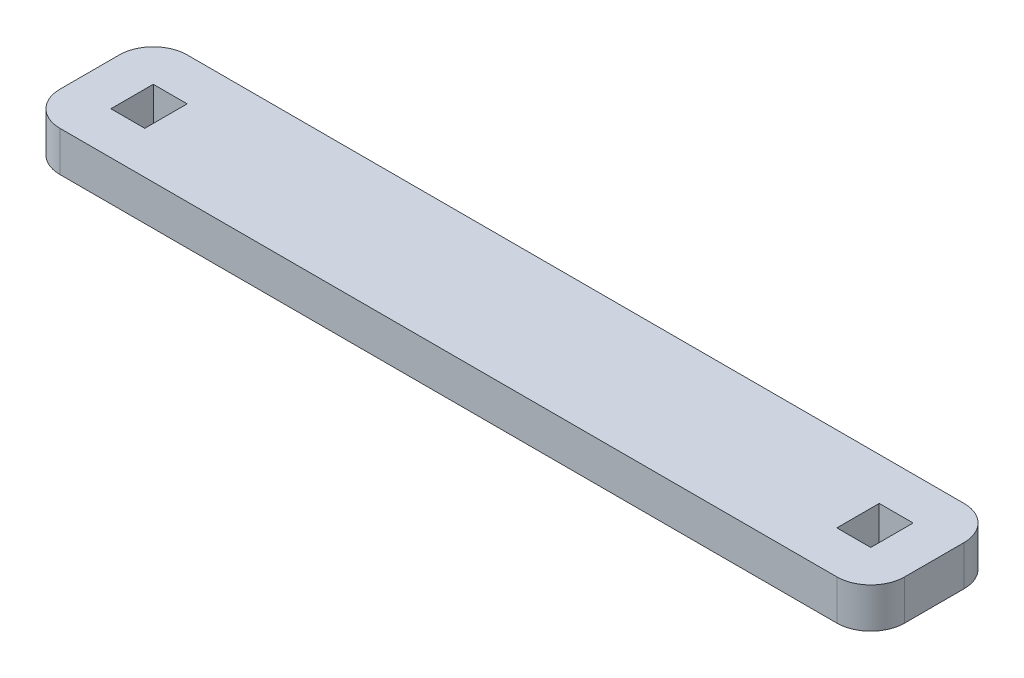
ISO-10303-21;
HEADER;
FILE_DESCRIPTION(('STEP AP214'),'2;1');
FILE_NAME('part.step','',(''),(''),'','','');
FILE_SCHEMA(('AUTOMOTIVE_DESIGN { 1 0 10303 214 1 1 1 1 }'));
ENDSEC;
DATA;
#1=APPLICATION_CONTEXT('core data for automotive mechanical design processes');
#2=APPLICATION_PROTOCOL_DEFINITION('international standard','automotive_design',2000,#1);
#3=PRODUCT_CONTEXT('',#1,'mechanical');
#4=PRODUCT('Part','Part','',(#3));
#5=PRODUCT_RELATED_PRODUCT_CATEGORY('part','',(#4));
#6=PRODUCT_DEFINITION_FORMATION('','',#4);
#7=PRODUCT_DEFINITION_CONTEXT('part definition',#1,'design');
#8=PRODUCT_DEFINITION('design','',#6,#7);
#9=PRODUCT_DEFINITION_SHAPE('','',#8);
#10=(LENGTH_UNIT() NAMED_UNIT(*) SI_UNIT(.MILLI.,.METRE.));
#11=(NAMED_UNIT(*) PLANE_ANGLE_UNIT() SI_UNIT($,.RADIAN.));
#12=(NAMED_UNIT(*) SI_UNIT($,.STERADIAN.) SOLID_ANGLE_UNIT());
#13=UNCERTAINTY_MEASURE_WITH_UNIT(LENGTH_MEASURE(1.E-05),#10,'distance_accuracy_value','');
#14=(GEOMETRIC_REPRESENTATION_CONTEXT(3) GLOBAL_UNCERTAINTY_ASSIGNED_CONTEXT((#13)) GLOBAL_UNIT_ASSIGNED_CONTEXT((#10,
#11,#12)) REPRESENTATION_CONTEXT('',''));
#15=CARTESIAN_POINT('',(0.,0.,0.));
#16=DIRECTION('',(0.,0.,1.));
#17=DIRECTION('',(1.,0.,0.));
#18=AXIS2_PLACEMENT_3D('',#15,#16,#17);
#19=CARTESIAN_POINT('',(0.,1.5,0.));
#20=DIRECTION('',(0.,1.,0.));
#21=DIRECTION('',(0.,0.,1.));
#22=AXIS2_PLACEMENT_3D('',#19,#20,#21);
#23=PLANE('',#22);
#24=DIRECTION('',(-1.,0.,0.));
#25=VECTOR('',#24,1.);
#26=CARTESIAN_POINT('',(31.623,1.5,-4.7625));
#27=LINE('',#26,#25);
#28=CARTESIAN_POINT('',(29.083,1.5,-4.7625));
#29=VERTEX_POINT('',#28);
#30=CARTESIAN_POINT('',(-29.083,1.5,-4.7625));
#31=VERTEX_POINT('',#30);
#32=EDGE_CURVE('E268',#29,#31,#27,.T.);
#33=ORIENTED_EDGE('',*,*,#32,.T.);
#34=CARTESIAN_POINT('',(-29.083,1.5,-2.2225));
#35=DIRECTION('',(0.,1.,0.));
#36=DIRECTION('',(0.,0.,1.));
#37=AXIS2_PLACEMENT_3D('',#34,#35,#36);
#38=CIRCLE('',#37,2.54);
#39=CARTESIAN_POINT('',(-31.623,1.5,-2.2225));
#40=VERTEX_POINT('',#39);
#41=EDGE_CURVE('E319',#31,#40,#38,.T.);
#42=ORIENTED_EDGE('',*,*,#41,.T.);
#43=DIRECTION('',(0.,0.,1.));
#44=VECTOR('',#43,1.);
#45=CARTESIAN_POINT('',(-31.623,1.5,4.7625));
#46=LINE('',#45,#44);
#47=CARTESIAN_POINT('',(-31.623,1.5,2.2225));
#48=VERTEX_POINT('',#47);
#49=EDGE_CURVE('E257',#40,#48,#46,.T.);
#50=ORIENTED_EDGE('',*,*,#49,.T.);
#51=CARTESIAN_POINT('',(-29.083,1.5,2.2225));
#52=DIRECTION('',(0.,1.,0.));
#53=DIRECTION('',(0.,0.,1.));
#54=AXIS2_PLACEMENT_3D('',#51,#52,#53);
#55=CIRCLE('',#54,2.54);
#56=CARTESIAN_POINT('',(-29.083,1.5,4.7625));
#57=VERTEX_POINT('',#56);
#58=EDGE_CURVE('E311',#48,#57,#55,.T.);
#59=ORIENTED_EDGE('',*,*,#58,.T.);
#60=DIRECTION('',(1.,0.,0.));
#61=VECTOR('',#60,1.);
#62=CARTESIAN_POINT('',(31.623,1.5,4.7625));
#63=LINE('',#62,#61);
#64=CARTESIAN_POINT('',(29.083,1.5,4.7625));
#65=VERTEX_POINT('',#64);
#66=EDGE_CURVE('E261',#57,#65,#63,.T.);
#67=ORIENTED_EDGE('',*,*,#66,.T.);
#68=CARTESIAN_POINT('',(29.083,1.5,2.2225));
#69=DIRECTION('',(0.,1.,0.));
#70=DIRECTION('',(0.,0.,1.));
#71=AXIS2_PLACEMENT_3D('',#68,#69,#70);
#72=CIRCLE('',#71,2.54);
#73=CARTESIAN_POINT('',(31.623,1.5,2.2225));
#74=VERTEX_POINT('',#73);
#75=EDGE_CURVE('E68',#65,#74,#72,.T.);
#76=ORIENTED_EDGE('',*,*,#75,.T.);
#77=DIRECTION('',(0.,0.,-1.));
#78=VECTOR('',#77,1.);
#79=CARTESIAN_POINT('',(31.623,1.5,4.7625));
#80=LINE('',#79,#78);
#81=CARTESIAN_POINT('',(31.623,1.5,-2.2225));
#82=VERTEX_POINT('',#81);
#83=EDGE_CURVE('E265',#74,#82,#80,.T.);
#84=ORIENTED_EDGE('',*,*,#83,.T.);
#85=CARTESIAN_POINT('',(29.083,1.5,-2.2225));
#86=DIRECTION('',(0.,1.,0.));
#87=DIRECTION('',(0.,0.,1.));
#88=AXIS2_PLACEMENT_3D('',#85,#86,#87);
#89=CIRCLE('',#88,2.54);
#90=EDGE_CURVE('E316',#82,#29,#89,.T.);
#91=ORIENTED_EDGE('',*,*,#90,.T.);
#92=EDGE_LOOP('',(#33,#42,#50,#59,#67,#76,#84,#91));
#93=FACE_BOUND('',#92,.T.);
#94=DIRECTION('',(1.,0.,0.));
#95=VECTOR('',#94,1.);
#96=CARTESIAN_POINT('',(-25.908,1.5,1.5875));
#97=LINE('',#96,#95);
#98=CARTESIAN_POINT('',(-28.448,1.5,1.5875));
#99=VERTEX_POINT('',#98);
#100=CARTESIAN_POINT('',(-25.908,1.5,1.5875));
#101=VERTEX_POINT('',#100);
#102=EDGE_CURVE('E217',#99,#101,#97,.T.);
#103=ORIENTED_EDGE('',*,*,#102,.F.);
#104=DIRECTION('',(0.,0.,1.));
#105=VECTOR('',#104,1.);
#106=CARTESIAN_POINT('',(-28.448,1.5,1.5875));
#107=LINE('',#106,#105);
#108=CARTESIAN_POINT('',(-28.448,1.5,-1.5875));
#109=VERTEX_POINT('',#108);
#110=EDGE_CURVE('E214',#109,#99,#107,.T.);
#111=ORIENTED_EDGE('',*,*,#110,.F.);
#112=DIRECTION('',(-1.,0.,0.));
#113=VECTOR('',#112,1.);
#114=CARTESIAN_POINT('',(-25.908,1.5,-1.5875));
#115=LINE('',#114,#113);
#116=CARTESIAN_POINT('',(-25.908,1.5,-1.5875));
#117=VERTEX_POINT('',#116);
#118=EDGE_CURVE('E225',#117,#109,#115,.T.);
#119=ORIENTED_EDGE('',*,*,#118,.F.);
#120=DIRECTION('',(0.,0.,-1.));
#121=VECTOR('',#120,1.);
#122=CARTESIAN_POINT('',(-25.908,1.5,1.5875));
#123=LINE('',#122,#121);
#124=EDGE_CURVE('E221',#101,#117,#123,.T.);
#125=ORIENTED_EDGE('',*,*,#124,.F.);
#126=EDGE_LOOP('',(#103,#111,#119,#125));
#127=FACE_BOUND('',#126,.T.);
#128=DIRECTION('',(1.,0.,0.));
#129=VECTOR('',#128,1.);
#130=CARTESIAN_POINT('',(28.448,1.5,1.5875));
#131=LINE('',#130,#129);
#132=CARTESIAN_POINT('',(25.908,1.5,1.5875));
#133=VERTEX_POINT('',#132);
#134=CARTESIAN_POINT('',(28.448,1.5,1.5875));
#135=VERTEX_POINT('',#134);
#136=EDGE_CURVE('E172',#133,#135,#131,.T.);
#137=ORIENTED_EDGE('',*,*,#136,.F.);
#138=DIRECTION('',(0.,0.,1.));
#139=VECTOR('',#138,1.);
#140=CARTESIAN_POINT('',(25.908,1.5,1.5875));
#141=LINE('',#140,#139);
#142=CARTESIAN_POINT('',(25.908,1.5,-1.5875));
#143=VERTEX_POINT('',#142);
#144=EDGE_CURVE('E161',#143,#133,#141,.T.);
#145=ORIENTED_EDGE('',*,*,#144,.F.);
#146=DIRECTION('',(-1.,0.,0.));
#147=VECTOR('',#146,1.);
#148=CARTESIAN_POINT('',(28.448,1.5,-1.5875));
#149=LINE('',#148,#147);
#150=CARTESIAN_POINT('',(28.448,1.5,-1.5875));
#151=VERTEX_POINT('',#150);
#152=EDGE_CURVE('E190',#151,#143,#149,.T.);
#153=ORIENTED_EDGE('',*,*,#152,.F.);
#154=DIRECTION('',(0.,0.,-1.));
#155=VECTOR('',#154,1.);
#156=CARTESIAN_POINT('',(28.448,1.5,1.5875));
#157=LINE('',#156,#155);
#158=EDGE_CURVE('E186',#135,#151,#157,.T.);
#159=ORIENTED_EDGE('',*,*,#158,.F.);
#160=EDGE_LOOP('',(#137,#145,#153,#159));
#161=FACE_BOUND('',#160,.T.);
#162=ADVANCED_FACE('F45',(#93,#127,#161),#23,.T.);
#163=CARTESIAN_POINT('',(0.,-1.5,0.));
#164=DIRECTION('',(0.,1.,0.));
#165=DIRECTION('',(0.,0.,1.));
#166=AXIS2_PLACEMENT_3D('',#163,#164,#165);
#167=PLANE('',#166);
#168=DIRECTION('',(0.,0.,1.));
#169=VECTOR('',#168,1.);
#170=CARTESIAN_POINT('',(-28.448,-1.5,1.5875));
#171=LINE('',#170,#169);
#172=CARTESIAN_POINT('',(-28.448,-1.5,-1.5875));
#173=VERTEX_POINT('',#172);
#174=CARTESIAN_POINT('',(-28.448,-1.5,1.5875));
#175=VERTEX_POINT('',#174);
#176=EDGE_CURVE('E181',#173,#175,#171,.T.);
#177=ORIENTED_EDGE('',*,*,#176,.T.);
#178=DIRECTION('',(1.,0.,0.));
#179=VECTOR('',#178,1.);
#180=CARTESIAN_POINT('',(-25.908,-1.5,1.5875));
#181=LINE('',#180,#179);
#182=CARTESIAN_POINT('',(-25.908,-1.5,1.5875));
#183=VERTEX_POINT('',#182);
#184=EDGE_CURVE('E232',#175,#183,#181,.T.);
#185=ORIENTED_EDGE('',*,*,#184,.T.);
#186=DIRECTION('',(0.,0.,-1.));
#187=VECTOR('',#186,1.);
#188=CARTESIAN_POINT('',(-25.908,-1.5,1.5875));
#189=LINE('',#188,#187);
#190=CARTESIAN_POINT('',(-25.908,-1.5,-1.5875));
#191=VERTEX_POINT('',#190);
#192=EDGE_CURVE('E236',#183,#191,#189,.T.);
#193=ORIENTED_EDGE('',*,*,#192,.T.);
#194=DIRECTION('',(-1.,0.,0.));
#195=VECTOR('',#194,1.);
#196=CARTESIAN_POINT('',(-25.908,-1.5,-1.5875));
#197=LINE('',#196,#195);
#198=EDGE_CURVE('E218',#191,#173,#197,.T.);
#199=ORIENTED_EDGE('',*,*,#198,.T.);
#200=EDGE_LOOP('',(#177,#185,#193,#199));
#201=FACE_BOUND('',#200,.T.);
#202=DIRECTION('',(0.,0.,1.));
#203=VECTOR('',#202,1.);
#204=CARTESIAN_POINT('',(-31.623,-1.5,4.7625));
#205=LINE('',#204,#203);
#206=CARTESIAN_POINT('',(-31.623,-1.5,-2.2225));
#207=VERTEX_POINT('',#206);
#208=CARTESIAN_POINT('',(-31.623,-1.5,2.2225));
#209=VERTEX_POINT('',#208);
#210=EDGE_CURVE('E256',#207,#209,#205,.T.);
#211=ORIENTED_EDGE('',*,*,#210,.F.);
#212=CARTESIAN_POINT('',(-29.083,-1.5,-2.2225));
#213=DIRECTION('',(0.,1.,0.));
#214=DIRECTION('',(0.,0.,1.));
#215=AXIS2_PLACEMENT_3D('',#212,#213,#214);
#216=CIRCLE('',#215,2.54);
#217=CARTESIAN_POINT('',(-29.083,-1.5,-4.7625));
#218=VERTEX_POINT('',#217);
#219=EDGE_CURVE('E301',#207,#218,#216,.F.);
#220=ORIENTED_EDGE('',*,*,#219,.T.);
#221=DIRECTION('',(-1.,0.,0.));
#222=VECTOR('',#221,1.);
#223=CARTESIAN_POINT('',(31.623,-1.5,-4.7625));
#224=LINE('',#223,#222);
#225=CARTESIAN_POINT('',(29.083,-1.5,-4.7625));
#226=VERTEX_POINT('',#225);
#227=EDGE_CURVE('E262',#226,#218,#224,.T.);
#228=ORIENTED_EDGE('',*,*,#227,.F.);
#229=CARTESIAN_POINT('',(29.083,-1.5,-2.2225));
#230=DIRECTION('',(0.,1.,0.));
#231=DIRECTION('',(0.,0.,1.));
#232=AXIS2_PLACEMENT_3D('',#229,#230,#231);
#233=CIRCLE('',#232,2.54);
#234=CARTESIAN_POINT('',(31.623,-1.5,-2.2225));
#235=VERTEX_POINT('',#234);
#236=EDGE_CURVE('E298',#226,#235,#233,.F.);
#237=ORIENTED_EDGE('',*,*,#236,.T.);
#238=DIRECTION('',(0.,0.,-1.));
#239=VECTOR('',#238,1.);
#240=CARTESIAN_POINT('',(31.623,-1.5,4.7625));
#241=LINE('',#240,#239);
#242=CARTESIAN_POINT('',(31.623,-1.5,2.2225));
#243=VERTEX_POINT('',#242);
#244=EDGE_CURVE('E280',#243,#235,#241,.T.);
#245=ORIENTED_EDGE('',*,*,#244,.F.);
#246=CARTESIAN_POINT('',(29.083,-1.5,2.2225));
#247=DIRECTION('',(0.,1.,0.));
#248=DIRECTION('',(0.,0.,1.));
#249=AXIS2_PLACEMENT_3D('',#246,#247,#248);
#250=CIRCLE('',#249,2.54);
#251=CARTESIAN_POINT('',(29.083,-1.5,4.7625));
#252=VERTEX_POINT('',#251);
#253=EDGE_CURVE('E295',#243,#252,#250,.F.);
#254=ORIENTED_EDGE('',*,*,#253,.T.);
#255=DIRECTION('',(1.,0.,0.));
#256=VECTOR('',#255,1.);
#257=CARTESIAN_POINT('',(31.623,-1.5,4.7625));
#258=LINE('',#257,#256);
#259=CARTESIAN_POINT('',(-29.083,-1.5,4.7625));
#260=VERTEX_POINT('',#259);
#261=EDGE_CURVE('E276',#260,#252,#258,.T.);
#262=ORIENTED_EDGE('',*,*,#261,.F.);
#263=CARTESIAN_POINT('',(-29.083,-1.5,2.2225));
#264=DIRECTION('',(0.,1.,0.));
#265=DIRECTION('',(0.,0.,1.));
#266=AXIS2_PLACEMENT_3D('',#263,#264,#265);
#267=CIRCLE('',#266,2.54);
#268=EDGE_CURVE('E292',#260,#209,#267,.F.);
#269=ORIENTED_EDGE('',*,*,#268,.T.);
#270=EDGE_LOOP('',(#211,#220,#228,#237,#245,#254,#262,#269));
#271=FACE_BOUND('',#270,.T.);
#272=DIRECTION('',(0.,0.,1.));
#273=VECTOR('',#272,1.);
#274=CARTESIAN_POINT('',(25.908,-1.5,1.5875));
#275=LINE('',#274,#273);
#276=CARTESIAN_POINT('',(25.908,-1.5,-1.5875));
#277=VERTEX_POINT('',#276);
#278=CARTESIAN_POINT('',(25.908,-1.5,1.5875));
#279=VERTEX_POINT('',#278);
#280=EDGE_CURVE('E195',#277,#279,#275,.T.);
#281=ORIENTED_EDGE('',*,*,#280,.T.);
#282=DIRECTION('',(1.,0.,0.));
#283=VECTOR('',#282,1.);
#284=CARTESIAN_POINT('',(28.448,-1.5,1.5875));
#285=LINE('',#284,#283);
#286=CARTESIAN_POINT('',(28.448,-1.5,1.5875));
#287=VERTEX_POINT('',#286);
#288=EDGE_CURVE('E179',#279,#287,#285,.T.);
#289=ORIENTED_EDGE('',*,*,#288,.T.);
#290=DIRECTION('',(0.,0.,-1.));
#291=VECTOR('',#290,1.);
#292=CARTESIAN_POINT('',(28.448,-1.5,1.5875));
#293=LINE('',#292,#291);
#294=CARTESIAN_POINT('',(28.448,-1.5,-1.5875));
#295=VERTEX_POINT('',#294);
#296=EDGE_CURVE('E200',#287,#295,#293,.T.);
#297=ORIENTED_EDGE('',*,*,#296,.T.);
#298=DIRECTION('',(-1.,0.,0.));
#299=VECTOR('',#298,1.);
#300=CARTESIAN_POINT('',(28.448,-1.5,-1.5875));
#301=LINE('',#300,#299);
#302=EDGE_CURVE('E173',#295,#277,#301,.T.);
#303=ORIENTED_EDGE('',*,*,#302,.T.);
#304=EDGE_LOOP('',(#281,#289,#297,#303));
#305=FACE_BOUND('',#304,.T.);
#306=ADVANCED_FACE('F339',(#201,#271,#305),#167,.F.);
#307=CARTESIAN_POINT('',(-31.623,1.5,4.7625));
#308=DIRECTION('',(1.,0.,0.));
#309=DIRECTION('',(0.,0.,-1.));
#310=AXIS2_PLACEMENT_3D('',#307,#308,#309);
#311=PLANE('',#310);
#312=ORIENTED_EDGE('',*,*,#49,.F.);
#313=DIRECTION('',(0.,-1.,0.));
#314=VECTOR('',#313,1.);
#315=CARTESIAN_POINT('',(-31.623,1.5,-2.2225));
#316=LINE('',#315,#314);
#317=EDGE_CURVE('E288',#40,#207,#316,.T.);
#318=ORIENTED_EDGE('',*,*,#317,.T.);
#319=ORIENTED_EDGE('',*,*,#210,.T.);
#320=DIRECTION('',(0.,-1.,0.));
#321=VECTOR('',#320,1.);
#322=CARTESIAN_POINT('',(-31.623,1.5,2.2225));
#323=LINE('',#322,#321);
#324=EDGE_CURVE('E272',#209,#48,#323,.F.);
#325=ORIENTED_EDGE('',*,*,#324,.T.);
#326=EDGE_LOOP('',(#312,#318,#319,#325));
#327=FACE_BOUND('',#326,.T.);
#328=ADVANCED_FACE('F362',(#327),#311,.F.);
#329=CARTESIAN_POINT('',(31.623,1.5,4.7625));
#330=DIRECTION('',(0.,0.,-1.));
#331=DIRECTION('',(-1.,0.,0.));
#332=AXIS2_PLACEMENT_3D('',#329,#330,#331);
#333=PLANE('',#332);
#334=ORIENTED_EDGE('',*,*,#261,.T.);
#335=DIRECTION('',(0.,-1.,0.));
#336=VECTOR('',#335,1.);
#337=CARTESIAN_POINT('',(29.083,1.5,4.7625));
#338=LINE('',#337,#336);
#339=EDGE_CURVE('E11',#252,#65,#338,.F.);
#340=ORIENTED_EDGE('',*,*,#339,.T.);
#341=ORIENTED_EDGE('',*,*,#66,.F.);
#342=DIRECTION('',(0.,-1.,0.));
#343=VECTOR('',#342,1.);
#344=CARTESIAN_POINT('',(-29.083,1.5,4.7625));
#345=LINE('',#344,#343);
#346=EDGE_CURVE('E54',#57,#260,#345,.T.);
#347=ORIENTED_EDGE('',*,*,#346,.T.);
#348=EDGE_LOOP('',(#334,#340,#341,#347));
#349=FACE_BOUND('',#348,.T.);
#350=ADVANCED_FACE('F333',(#349),#333,.F.);
#351=CARTESIAN_POINT('',(31.623,1.5,4.7625));
#352=DIRECTION('',(-1.,0.,0.));
#353=DIRECTION('',(0.,0.,1.));
#354=AXIS2_PLACEMENT_3D('',#351,#352,#353);
#355=PLANE('',#354);
#356=ORIENTED_EDGE('',*,*,#244,.T.);
#357=DIRECTION('',(0.,-1.,0.));
#358=VECTOR('',#357,1.);
#359=CARTESIAN_POINT('',(31.623,1.5,-2.2225));
#360=LINE('',#359,#358);
#361=EDGE_CURVE('E61',#235,#82,#360,.F.);
#362=ORIENTED_EDGE('',*,*,#361,.T.);
#363=ORIENTED_EDGE('',*,*,#83,.F.);
#364=DIRECTION('',(0.,-1.,0.));
#365=VECTOR('',#364,1.);
#366=CARTESIAN_POINT('',(31.623,1.5,2.2225));
#367=LINE('',#366,#365);
#368=EDGE_CURVE('E322',#74,#243,#367,.T.);
#369=ORIENTED_EDGE('',*,*,#368,.T.);
#370=EDGE_LOOP('',(#356,#362,#363,#369));
#371=FACE_BOUND('',#370,.T.);
#372=ADVANCED_FACE('F345',(#371),#355,.F.);
#373=CARTESIAN_POINT('',(31.623,1.5,-4.7625));
#374=DIRECTION('',(0.,0.,1.));
#375=DIRECTION('',(1.,0.,0.));
#376=AXIS2_PLACEMENT_3D('',#373,#374,#375);
#377=PLANE('',#376);
#378=ORIENTED_EDGE('',*,*,#227,.T.);
#379=DIRECTION('',(0.,-1.,0.));
#380=VECTOR('',#379,1.);
#381=CARTESIAN_POINT('',(-29.083,1.5,-4.7625));
#382=LINE('',#381,#380);
#383=EDGE_CURVE('E308',#218,#31,#382,.F.);
#384=ORIENTED_EDGE('',*,*,#383,.T.);
#385=ORIENTED_EDGE('',*,*,#32,.F.);
#386=DIRECTION('',(0.,-1.,0.));
#387=VECTOR('',#386,1.);
#388=CARTESIAN_POINT('',(29.083,1.5,-4.7625));
#389=LINE('',#388,#387);
#390=EDGE_CURVE('E304',#29,#226,#389,.T.);
#391=ORIENTED_EDGE('',*,*,#390,.T.);
#392=EDGE_LOOP('',(#378,#384,#385,#391));
#393=FACE_BOUND('',#392,.T.);
#394=ADVANCED_FACE('F354',(#393),#377,.F.);
#395=CARTESIAN_POINT('',(-28.448,1.5,1.5875));
#396=DIRECTION('',(1.,0.,0.));
#397=DIRECTION('',(0.,0.,-1.));
#398=AXIS2_PLACEMENT_3D('',#395,#396,#397);
#399=PLANE('',#398);
#400=ORIENTED_EDGE('',*,*,#176,.F.);
#401=DIRECTION('',(0.,-1.,0.));
#402=VECTOR('',#401,1.);
#403=CARTESIAN_POINT('',(-28.448,1.5,-1.5875));
#404=LINE('',#403,#402);
#405=EDGE_CURVE('E228',#109,#173,#404,.T.);
#406=ORIENTED_EDGE('',*,*,#405,.F.);
#407=ORIENTED_EDGE('',*,*,#110,.T.);
#408=DIRECTION('',(0.,-1.,0.));
#409=VECTOR('',#408,1.);
#410=CARTESIAN_POINT('',(-28.448,1.5,1.5875));
#411=LINE('',#410,#409);
#412=EDGE_CURVE('E252',#99,#175,#411,.T.);
#413=ORIENTED_EDGE('',*,*,#412,.T.);
#414=EDGE_LOOP('',(#400,#406,#407,#413));
#415=FACE_BOUND('',#414,.T.);
#416=ADVANCED_FACE('F377',(#415),#399,.T.);
#417=CARTESIAN_POINT('',(-25.908,1.5,1.5875));
#418=DIRECTION('',(0.,0.,-1.));
#419=DIRECTION('',(-1.,0.,0.));
#420=AXIS2_PLACEMENT_3D('',#417,#418,#419);
#421=PLANE('',#420);
#422=ORIENTED_EDGE('',*,*,#184,.F.);
#423=ORIENTED_EDGE('',*,*,#412,.F.);
#424=ORIENTED_EDGE('',*,*,#102,.T.);
#425=DIRECTION('',(0.,-1.,0.));
#426=VECTOR('',#425,1.);
#427=CARTESIAN_POINT('',(-25.908,1.5,1.5875));
#428=LINE('',#427,#426);
#429=EDGE_CURVE('E249',#101,#183,#428,.T.);
#430=ORIENTED_EDGE('',*,*,#429,.T.);
#431=EDGE_LOOP('',(#422,#423,#424,#430));
#432=FACE_BOUND('',#431,.T.);
#433=ADVANCED_FACE('F459',(#432),#421,.T.);
#434=CARTESIAN_POINT('',(-25.908,1.5,1.5875));
#435=DIRECTION('',(-1.,0.,0.));
#436=DIRECTION('',(0.,0.,1.));
#437=AXIS2_PLACEMENT_3D('',#434,#435,#436);
#438=PLANE('',#437);
#439=ORIENTED_EDGE('',*,*,#192,.F.);
#440=ORIENTED_EDGE('',*,*,#429,.F.);
#441=ORIENTED_EDGE('',*,*,#124,.T.);
#442=DIRECTION('',(0.,-1.,0.));
#443=VECTOR('',#442,1.);
#444=CARTESIAN_POINT('',(-25.908,1.5,-1.5875));
#445=LINE('',#444,#443);
#446=EDGE_CURVE('E246',#117,#191,#445,.T.);
#447=ORIENTED_EDGE('',*,*,#446,.T.);
#448=EDGE_LOOP('',(#439,#440,#441,#447));
#449=FACE_BOUND('',#448,.T.);
#450=ADVANCED_FACE('F450',(#449),#438,.T.);
#451=CARTESIAN_POINT('',(-25.908,1.5,-1.5875));
#452=DIRECTION('',(0.,0.,1.));
#453=DIRECTION('',(1.,0.,0.));
#454=AXIS2_PLACEMENT_3D('',#451,#452,#453);
#455=PLANE('',#454);
#456=ORIENTED_EDGE('',*,*,#198,.F.);
#457=ORIENTED_EDGE('',*,*,#446,.F.);
#458=ORIENTED_EDGE('',*,*,#118,.T.);
#459=ORIENTED_EDGE('',*,*,#405,.T.);
#460=EDGE_LOOP('',(#456,#457,#458,#459));
#461=FACE_BOUND('',#460,.T.);
#462=ADVANCED_FACE('F442',(#461),#455,.T.);
#463=CARTESIAN_POINT('',(25.908,1.5,1.5875));
#464=DIRECTION('',(1.,0.,0.));
#465=DIRECTION('',(0.,0.,-1.));
#466=AXIS2_PLACEMENT_3D('',#463,#464,#465);
#467=PLANE('',#466);
#468=ORIENTED_EDGE('',*,*,#280,.F.);
#469=DIRECTION('',(0.,-1.,0.));
#470=VECTOR('',#469,1.);
#471=CARTESIAN_POINT('',(25.908,1.5,-1.5875));
#472=LINE('',#471,#470);
#473=EDGE_CURVE('E167',#143,#277,#472,.T.);
#474=ORIENTED_EDGE('',*,*,#473,.F.);
#475=ORIENTED_EDGE('',*,*,#144,.T.);
#476=DIRECTION('',(0.,-1.,0.));
#477=VECTOR('',#476,1.);
#478=CARTESIAN_POINT('',(25.908,1.5,1.5875));
#479=LINE('',#478,#477);
#480=EDGE_CURVE('E164',#133,#279,#479,.T.);
#481=ORIENTED_EDGE('',*,*,#480,.T.);
#482=EDGE_LOOP('',(#468,#474,#475,#481));
#483=FACE_BOUND('',#482,.T.);
#484=ADVANCED_FACE('F163',(#483),#467,.T.);
#485=CARTESIAN_POINT('',(28.448,1.5,1.5875));
#486=DIRECTION('',(0.,0.,-1.));
#487=DIRECTION('',(-1.,0.,0.));
#488=AXIS2_PLACEMENT_3D('',#485,#486,#487);
#489=PLANE('',#488);
#490=ORIENTED_EDGE('',*,*,#288,.F.);
#491=ORIENTED_EDGE('',*,*,#480,.F.);
#492=ORIENTED_EDGE('',*,*,#136,.T.);
#493=DIRECTION('',(0.,-1.,0.));
#494=VECTOR('',#493,1.);
#495=CARTESIAN_POINT('',(28.448,1.5,1.5875));
#496=LINE('',#495,#494);
#497=EDGE_CURVE('E182',#135,#287,#496,.T.);
#498=ORIENTED_EDGE('',*,*,#497,.T.);
#499=EDGE_LOOP('',(#490,#491,#492,#498));
#500=FACE_BOUND('',#499,.T.);
#501=ADVANCED_FACE('F176',(#500),#489,.T.);
#502=CARTESIAN_POINT('',(28.448,1.5,1.5875));
#503=DIRECTION('',(-1.,0.,0.));
#504=DIRECTION('',(0.,0.,1.));
#505=AXIS2_PLACEMENT_3D('',#502,#503,#504);
#506=PLANE('',#505);
#507=ORIENTED_EDGE('',*,*,#296,.F.);
#508=ORIENTED_EDGE('',*,*,#497,.F.);
#509=ORIENTED_EDGE('',*,*,#158,.T.);
#510=DIRECTION('',(0.,-1.,0.));
#511=VECTOR('',#510,1.);
#512=CARTESIAN_POINT('',(28.448,1.5,-1.5875));
#513=LINE('',#512,#511);
#514=EDGE_CURVE('E209',#151,#295,#513,.T.);
#515=ORIENTED_EDGE('',*,*,#514,.T.);
#516=EDGE_LOOP('',(#507,#508,#509,#515));
#517=FACE_BOUND('',#516,.T.);
#518=ADVANCED_FACE('F418',(#517),#506,.T.);
#519=CARTESIAN_POINT('',(28.448,1.5,-1.5875));
#520=DIRECTION('',(0.,0.,1.));
#521=DIRECTION('',(1.,0.,0.));
#522=AXIS2_PLACEMENT_3D('',#519,#520,#521);
#523=PLANE('',#522);
#524=ORIENTED_EDGE('',*,*,#302,.F.);
#525=ORIENTED_EDGE('',*,*,#514,.F.);
#526=ORIENTED_EDGE('',*,*,#152,.T.);
#527=ORIENTED_EDGE('',*,*,#473,.T.);
#528=EDGE_LOOP('',(#524,#525,#526,#527));
#529=FACE_BOUND('',#528,.T.);
#530=ADVANCED_FACE('F390',(#529),#523,.T.);
#531=CARTESIAN_POINT('',(-29.083,1.5,-2.2225));
#532=DIRECTION('',(0.,-1.,0.));
#533=DIRECTION('',(0.,0.,-1.));
#534=AXIS2_PLACEMENT_3D('',#531,#532,#533);
#535=CYLINDRICAL_SURFACE('',#534,2.54);
#536=ORIENTED_EDGE('',*,*,#41,.F.);
#537=ORIENTED_EDGE('',*,*,#383,.F.);
#538=ORIENTED_EDGE('',*,*,#219,.F.);
#539=ORIENTED_EDGE('',*,*,#317,.F.);
#540=EDGE_LOOP('',(#536,#537,#538,#539));
#541=FACE_BOUND('',#540,.T.);
#542=ADVANCED_FACE('F359',(#541),#535,.T.);
#543=CARTESIAN_POINT('',(29.083,1.5,-2.2225));
#544=DIRECTION('',(0.,-1.,0.));
#545=DIRECTION('',(0.,0.,-1.));
#546=AXIS2_PLACEMENT_3D('',#543,#544,#545);
#547=CYLINDRICAL_SURFACE('',#546,2.54);
#548=ORIENTED_EDGE('',*,*,#90,.F.);
#549=ORIENTED_EDGE('',*,*,#361,.F.);
#550=ORIENTED_EDGE('',*,*,#236,.F.);
#551=ORIENTED_EDGE('',*,*,#390,.F.);
#552=EDGE_LOOP('',(#548,#549,#550,#551));
#553=FACE_BOUND('',#552,.T.);
#554=ADVANCED_FACE('F351',(#553),#547,.T.);
#555=CARTESIAN_POINT('',(29.083,1.5,2.2225));
#556=DIRECTION('',(0.,-1.,0.));
#557=DIRECTION('',(0.,0.,-1.));
#558=AXIS2_PLACEMENT_3D('',#555,#556,#557);
#559=CYLINDRICAL_SURFACE('',#558,2.54);
#560=ORIENTED_EDGE('',*,*,#75,.F.);
#561=ORIENTED_EDGE('',*,*,#339,.F.);
#562=ORIENTED_EDGE('',*,*,#253,.F.);
#563=ORIENTED_EDGE('',*,*,#368,.F.);
#564=EDGE_LOOP('',(#560,#561,#562,#563));
#565=FACE_BOUND('',#564,.T.);
#566=ADVANCED_FACE('F344',(#565),#559,.T.);
#567=CARTESIAN_POINT('',(-29.083,1.5,2.2225));
#568=DIRECTION('',(0.,-1.,0.));
#569=DIRECTION('',(0.,0.,-1.));
#570=AXIS2_PLACEMENT_3D('',#567,#568,#569);
#571=CYLINDRICAL_SURFACE('',#570,2.54);
#572=ORIENTED_EDGE('',*,*,#58,.F.);
#573=ORIENTED_EDGE('',*,*,#324,.F.);
#574=ORIENTED_EDGE('',*,*,#268,.F.);
#575=ORIENTED_EDGE('',*,*,#346,.F.);
#576=EDGE_LOOP('',(#572,#573,#574,#575));
#577=FACE_BOUND('',#576,.T.);
#578=ADVANCED_FACE('F47',(#577),#571,.T.);
#579=CLOSED_SHELL('',(#162,#306,#328,#350,#372,#394,#416,#433,#450,#462,#484,#501,#518,#530,
#542,#554,#566,#578));
#580=MANIFOLD_SOLID_BREP('B2',#579);
#581=ADVANCED_BREP_SHAPE_REPRESENTATION('',(#18,#580),#14);
#582=SHAPE_DEFINITION_REPRESENTATION(#9,#581);
ENDSEC;
END-ISO-10303-21;
